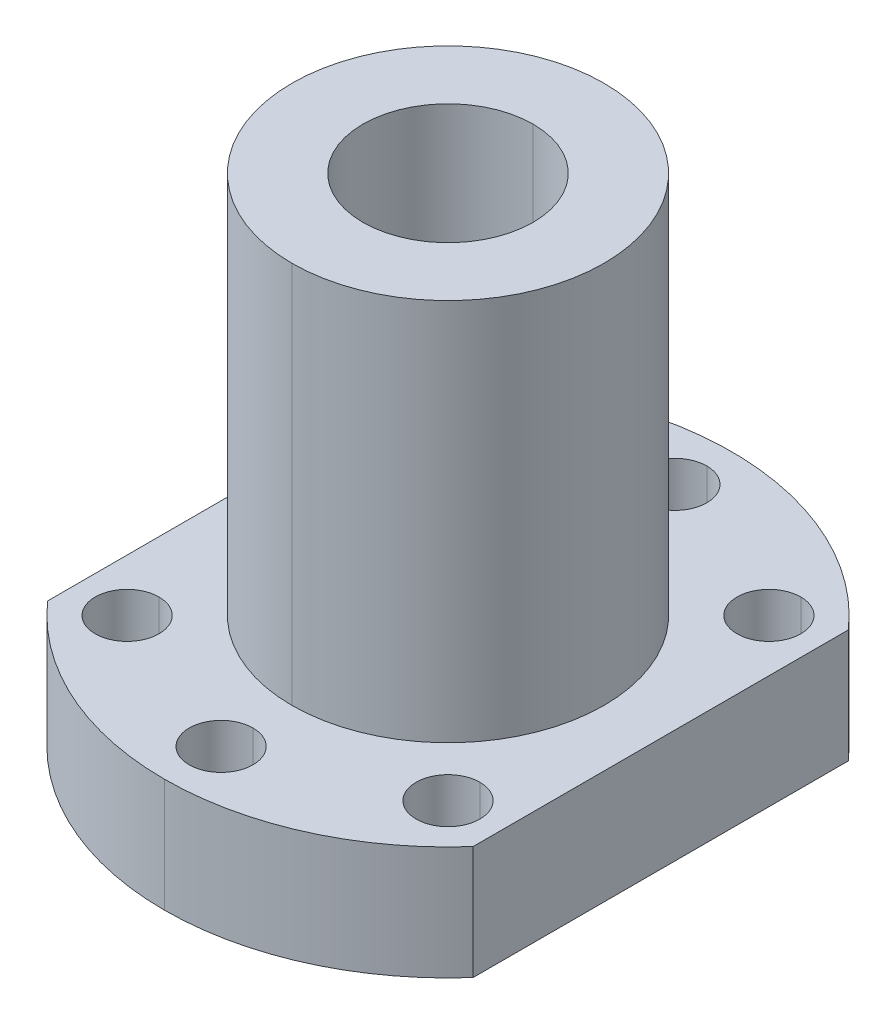
ISO-10303-21;
HEADER;
FILE_DESCRIPTION(('STEP AP214'),'2;1');
FILE_NAME('part.step','',(''),(''),'','','');
FILE_SCHEMA(('AUTOMOTIVE_DESIGN { 1 0 10303 214 1 1 1 1 }'));
ENDSEC;
DATA;
#1=APPLICATION_CONTEXT('core data for automotive mechanical design processes');
#2=APPLICATION_PROTOCOL_DEFINITION('international standard','automotive_design',2000,#1);
#3=PRODUCT_CONTEXT('',#1,'mechanical');
#4=PRODUCT('Part','Part','',(#3));
#5=PRODUCT_RELATED_PRODUCT_CATEGORY('part','',(#4));
#6=PRODUCT_DEFINITION_FORMATION('','',#4);
#7=PRODUCT_DEFINITION_CONTEXT('part definition',#1,'design');
#8=PRODUCT_DEFINITION('design','',#6,#7);
#9=PRODUCT_DEFINITION_SHAPE('','',#8);
#10=(LENGTH_UNIT() NAMED_UNIT(*) SI_UNIT(.MILLI.,.METRE.));
#11=(NAMED_UNIT(*) PLANE_ANGLE_UNIT() SI_UNIT($,.RADIAN.));
#12=(NAMED_UNIT(*) SI_UNIT($,.STERADIAN.) SOLID_ANGLE_UNIT());
#13=UNCERTAINTY_MEASURE_WITH_UNIT(LENGTH_MEASURE(1.E-05),#10,'distance_accuracy_value','');
#14=(GEOMETRIC_REPRESENTATION_CONTEXT(3) GLOBAL_UNCERTAINTY_ASSIGNED_CONTEXT((#13)) GLOBAL_UNIT_ASSIGNED_CONTEXT((#10,
#11,#12)) REPRESENTATION_CONTEXT('',''));
#15=CARTESIAN_POINT('',(0.,0.,0.));
#16=DIRECTION('',(0.,0.,1.));
#17=DIRECTION('',(1.,0.,0.));
#18=AXIS2_PLACEMENT_3D('',#15,#16,#17);
#19=CARTESIAN_POINT('',(-11.3137084989848,42.,11.3137084989848));
#20=DIRECTION('',(0.,1.,0.));
#21=DIRECTION('',(0.,0.,1.));
#22=AXIS2_PLACEMENT_3D('',#19,#20,#21);
#23=CYLINDRICAL_SURFACE('',#22,2.25);
#24=CARTESIAN_POINT('',(-11.3137084989848,42.,11.3137084989848));
#25=DIRECTION('',(0.,-1.,0.));
#26=DIRECTION('',(0.,0.,-1.));
#27=AXIS2_PLACEMENT_3D('',#24,#25,#26);
#28=CIRCLE('',#27,2.25);
#29=CARTESIAN_POINT('',(-11.3137084989848,42.,13.5637084989848));
#30=VERTEX_POINT('',#29);
#31=CARTESIAN_POINT('',(-11.3137084989848,42.,9.06370849898478));
#32=VERTEX_POINT('',#31);
#33=EDGE_CURVE('P0_E11',#30,#32,#28,.T.);
#34=ORIENTED_EDGE('',*,*,#33,.T.);
#35=DIRECTION('',(0.,1.,0.));
#36=VECTOR('',#35,1.);
#37=CARTESIAN_POINT('',(-11.3137084989848,42.,9.06370849898478));
#38=LINE('',#37,#36);
#39=CARTESIAN_POINT('',(-11.3137084989848,50.,9.06370849898478));
#40=VERTEX_POINT('',#39);
#41=EDGE_CURVE('P0_E27',#32,#40,#38,.T.);
#42=ORIENTED_EDGE('',*,*,#41,.T.);
#43=CARTESIAN_POINT('',(-11.3137084989848,50.,11.3137084989848));
#44=DIRECTION('',(0.,-1.,0.));
#45=DIRECTION('',(0.,0.,-1.));
#46=AXIS2_PLACEMENT_3D('',#43,#44,#45);
#47=CIRCLE('',#46,2.25);
#48=CARTESIAN_POINT('',(-11.3137084989848,50.,13.5637084989848));
#49=VERTEX_POINT('',#48);
#50=EDGE_CURVE('P0_E289',#49,#40,#47,.T.);
#51=ORIENTED_EDGE('',*,*,#50,.F.);
#52=DIRECTION('',(0.,1.,0.));
#53=VECTOR('',#52,1.);
#54=CARTESIAN_POINT('',(-11.3137084989848,42.,13.5637084989848));
#55=LINE('',#54,#53);
#56=EDGE_CURVE('P0_E246',#30,#49,#55,.T.);
#57=ORIENTED_EDGE('',*,*,#56,.F.);
#58=EDGE_LOOP('',(#34,#42,#51,#57));
#59=FACE_BOUND('',#58,.T.);
#60=ADVANCED_FACE('P0_F16',(#59),#23,.F.);
#61=CARTESIAN_POINT('',(-11.3137084989848,42.,-11.3137084989848));
#62=DIRECTION('',(0.,1.,0.));
#63=DIRECTION('',(0.,0.,1.));
#64=AXIS2_PLACEMENT_3D('',#61,#62,#63);
#65=CYLINDRICAL_SURFACE('',#64,2.25);
#66=CARTESIAN_POINT('',(-11.3137084989848,42.,-11.3137084989848));
#67=DIRECTION('',(0.,-1.,0.));
#68=DIRECTION('',(0.,0.,-1.));
#69=AXIS2_PLACEMENT_3D('',#66,#67,#68);
#70=CIRCLE('',#69,2.25);
#71=CARTESIAN_POINT('',(-11.3137084989848,42.,-9.06370849898477));
#72=VERTEX_POINT('',#71);
#73=CARTESIAN_POINT('',(-11.3137084989848,42.,-13.5637084989848));
#74=VERTEX_POINT('',#73);
#75=EDGE_CURVE('P0_E357',#72,#74,#70,.T.);
#76=ORIENTED_EDGE('',*,*,#75,.T.);
#77=DIRECTION('',(0.,1.,0.));
#78=VECTOR('',#77,1.);
#79=CARTESIAN_POINT('',(-11.3137084989848,42.,-13.5637084989848));
#80=LINE('',#79,#78);
#81=CARTESIAN_POINT('',(-11.3137084989848,50.,-13.5637084989848));
#82=VERTEX_POINT('',#81);
#83=EDGE_CURVE('P0_E344',#74,#82,#80,.T.);
#84=ORIENTED_EDGE('',*,*,#83,.T.);
#85=CARTESIAN_POINT('',(-11.3137084989848,50.,-11.3137084989848));
#86=DIRECTION('',(0.,-1.,0.));
#87=DIRECTION('',(0.,0.,-1.));
#88=AXIS2_PLACEMENT_3D('',#85,#86,#87);
#89=CIRCLE('',#88,2.25);
#90=CARTESIAN_POINT('',(-11.3137084989848,50.,-9.06370849898477));
#91=VERTEX_POINT('',#90);
#92=EDGE_CURVE('P0_E296',#91,#82,#89,.T.);
#93=ORIENTED_EDGE('',*,*,#92,.F.);
#94=DIRECTION('',(0.,1.,0.));
#95=VECTOR('',#94,1.);
#96=CARTESIAN_POINT('',(-11.3137084989848,42.,-9.06370849898477));
#97=LINE('',#96,#95);
#98=EDGE_CURVE('P0_E245',#72,#91,#97,.T.);
#99=ORIENTED_EDGE('',*,*,#98,.F.);
#100=EDGE_LOOP('',(#76,#84,#93,#99));
#101=FACE_BOUND('',#100,.T.);
#102=ADVANCED_FACE('P0_F663',(#101),#65,.F.);
#103=CARTESIAN_POINT('',(0.,42.,-16.));
#104=DIRECTION('',(0.,1.,0.));
#105=DIRECTION('',(0.,0.,1.));
#106=AXIS2_PLACEMENT_3D('',#103,#104,#105);
#107=CYLINDRICAL_SURFACE('',#106,2.25);
#108=CARTESIAN_POINT('',(0.,42.,-16.));
#109=DIRECTION('',(0.,-1.,0.));
#110=DIRECTION('',(0.,0.,-1.));
#111=AXIS2_PLACEMENT_3D('',#108,#109,#110);
#112=CIRCLE('',#111,2.25);
#113=CARTESIAN_POINT('',(0.,42.,-13.75));
#114=VERTEX_POINT('',#113);
#115=CARTESIAN_POINT('',(0.,42.,-18.25));
#116=VERTEX_POINT('',#115);
#117=EDGE_CURVE('P0_E340',#114,#116,#112,.T.);
#118=ORIENTED_EDGE('',*,*,#117,.T.);
#119=DIRECTION('',(0.,1.,0.));
#120=VECTOR('',#119,1.);
#121=CARTESIAN_POINT('',(0.,42.,-18.25));
#122=LINE('',#121,#120);
#123=CARTESIAN_POINT('',(0.,50.,-18.25));
#124=VERTEX_POINT('',#123);
#125=EDGE_CURVE('P0_E345',#116,#124,#122,.T.);
#126=ORIENTED_EDGE('',*,*,#125,.T.);
#127=CARTESIAN_POINT('',(0.,50.,-16.));
#128=DIRECTION('',(0.,-1.,0.));
#129=DIRECTION('',(0.,0.,-1.));
#130=AXIS2_PLACEMENT_3D('',#127,#128,#129);
#131=CIRCLE('',#130,2.25);
#132=CARTESIAN_POINT('',(0.,50.,-13.75));
#133=VERTEX_POINT('',#132);
#134=EDGE_CURVE('P0_E328',#133,#124,#131,.T.);
#135=ORIENTED_EDGE('',*,*,#134,.F.);
#136=DIRECTION('',(0.,1.,0.));
#137=VECTOR('',#136,1.);
#138=CARTESIAN_POINT('',(0.,42.,-13.75));
#139=LINE('',#138,#137);
#140=EDGE_CURVE('P0_E237',#114,#133,#139,.T.);
#141=ORIENTED_EDGE('',*,*,#140,.F.);
#142=EDGE_LOOP('',(#118,#126,#135,#141));
#143=FACE_BOUND('',#142,.T.);
#144=ADVANCED_FACE('P0_F625',(#143),#107,.F.);
#145=CARTESIAN_POINT('',(11.3137084989848,42.,-11.3137084989848));
#146=DIRECTION('',(0.,1.,0.));
#147=DIRECTION('',(0.,0.,1.));
#148=AXIS2_PLACEMENT_3D('',#145,#146,#147);
#149=CYLINDRICAL_SURFACE('',#148,2.25);
#150=CARTESIAN_POINT('',(11.3137084989848,42.,-11.3137084989848));
#151=DIRECTION('',(0.,-1.,0.));
#152=DIRECTION('',(0.,0.,-1.));
#153=AXIS2_PLACEMENT_3D('',#150,#151,#152);
#154=CIRCLE('',#153,2.25);
#155=CARTESIAN_POINT('',(11.3137084989848,42.,-9.06370849898477));
#156=VERTEX_POINT('',#155);
#157=CARTESIAN_POINT('',(11.3137084989848,42.,-13.5637084989848));
#158=VERTEX_POINT('',#157);
#159=EDGE_CURVE('P0_E369',#156,#158,#154,.T.);
#160=ORIENTED_EDGE('',*,*,#159,.T.);
#161=DIRECTION('',(0.,1.,0.));
#162=VECTOR('',#161,1.);
#163=CARTESIAN_POINT('',(11.3137084989848,42.,-13.5637084989848));
#164=LINE('',#163,#162);
#165=CARTESIAN_POINT('',(11.3137084989848,50.,-13.5637084989848));
#166=VERTEX_POINT('',#165);
#167=EDGE_CURVE('P0_E336',#158,#166,#164,.T.);
#168=ORIENTED_EDGE('',*,*,#167,.T.);
#169=CARTESIAN_POINT('',(11.3137084989848,50.,-11.3137084989848));
#170=DIRECTION('',(0.,-1.,0.));
#171=DIRECTION('',(0.,0.,-1.));
#172=AXIS2_PLACEMENT_3D('',#169,#170,#171);
#173=CIRCLE('',#172,2.25);
#174=CARTESIAN_POINT('',(11.3137084989848,50.,-9.06370849898477));
#175=VERTEX_POINT('',#174);
#176=EDGE_CURVE('P0_E311',#175,#166,#173,.T.);
#177=ORIENTED_EDGE('',*,*,#176,.F.);
#178=DIRECTION('',(0.,1.,0.));
#179=VECTOR('',#178,1.);
#180=CARTESIAN_POINT('',(11.3137084989848,42.,-9.06370849898477));
#181=LINE('',#180,#179);
#182=EDGE_CURVE('P0_E307',#156,#175,#181,.T.);
#183=ORIENTED_EDGE('',*,*,#182,.F.);
#184=EDGE_LOOP('',(#160,#168,#177,#183));
#185=FACE_BOUND('',#184,.T.);
#186=ADVANCED_FACE('P0_F620',(#185),#149,.F.);
#187=CARTESIAN_POINT('',(11.3137084989848,42.,11.3137084989848));
#188=DIRECTION('',(0.,1.,0.));
#189=DIRECTION('',(0.,0.,1.));
#190=AXIS2_PLACEMENT_3D('',#187,#188,#189);
#191=CYLINDRICAL_SURFACE('',#190,2.25);
#192=CARTESIAN_POINT('',(11.3137084989848,42.,11.3137084989848));
#193=DIRECTION('',(0.,-1.,0.));
#194=DIRECTION('',(0.,0.,-1.));
#195=AXIS2_PLACEMENT_3D('',#192,#193,#194);
#196=CIRCLE('',#195,2.25);
#197=CARTESIAN_POINT('',(11.3137084989848,42.,13.5637084989848));
#198=VERTEX_POINT('',#197);
#199=CARTESIAN_POINT('',(11.3137084989848,42.,9.06370849898477));
#200=VERTEX_POINT('',#199);
#201=EDGE_CURVE('P0_E332',#198,#200,#196,.T.);
#202=ORIENTED_EDGE('',*,*,#201,.T.);
#203=DIRECTION('',(0.,1.,0.));
#204=VECTOR('',#203,1.);
#205=CARTESIAN_POINT('',(11.3137084989848,42.,9.06370849898477));
#206=LINE('',#205,#204);
#207=CARTESIAN_POINT('',(11.3137084989848,50.,9.06370849898477));
#208=VERTEX_POINT('',#207);
#209=EDGE_CURVE('P0_E277',#200,#208,#206,.T.);
#210=ORIENTED_EDGE('',*,*,#209,.T.);
#211=CARTESIAN_POINT('',(11.3137084989848,50.,11.3137084989848));
#212=DIRECTION('',(0.,-1.,0.));
#213=DIRECTION('',(0.,0.,-1.));
#214=AXIS2_PLACEMENT_3D('',#211,#212,#213);
#215=CIRCLE('',#214,2.25);
#216=CARTESIAN_POINT('',(11.3137084989848,50.,13.5637084989848));
#217=VERTEX_POINT('',#216);
#218=EDGE_CURVE('P0_E283',#217,#208,#215,.T.);
#219=ORIENTED_EDGE('',*,*,#218,.F.);
#220=DIRECTION('',(0.,1.,0.));
#221=VECTOR('',#220,1.);
#222=CARTESIAN_POINT('',(11.3137084989848,42.,13.5637084989848));
#223=LINE('',#222,#221);
#224=EDGE_CURVE('P0_E264',#198,#217,#223,.T.);
#225=ORIENTED_EDGE('',*,*,#224,.F.);
#226=EDGE_LOOP('',(#202,#210,#219,#225));
#227=FACE_BOUND('',#226,.T.);
#228=ADVANCED_FACE('P0_F624',(#227),#191,.F.);
#229=CARTESIAN_POINT('',(0.,42.,16.));
#230=DIRECTION('',(0.,1.,0.));
#231=DIRECTION('',(0.,0.,1.));
#232=AXIS2_PLACEMENT_3D('',#229,#230,#231);
#233=CYLINDRICAL_SURFACE('',#232,2.25);
#234=CARTESIAN_POINT('',(0.,42.,16.));
#235=DIRECTION('',(0.,-1.,0.));
#236=DIRECTION('',(0.,0.,-1.));
#237=AXIS2_PLACEMENT_3D('',#234,#235,#236);
#238=CIRCLE('',#237,2.25);
#239=CARTESIAN_POINT('',(0.,42.,18.25));
#240=VERTEX_POINT('',#239);
#241=CARTESIAN_POINT('',(0.,42.,13.75));
#242=VERTEX_POINT('',#241);
#243=EDGE_CURVE('P0_E20',#240,#242,#238,.T.);
#244=ORIENTED_EDGE('',*,*,#243,.T.);
#245=DIRECTION('',(0.,1.,0.));
#246=VECTOR('',#245,1.);
#247=CARTESIAN_POINT('',(0.,42.,13.75));
#248=LINE('',#247,#246);
#249=CARTESIAN_POINT('',(0.,50.,13.75));
#250=VERTEX_POINT('',#249);
#251=EDGE_CURVE('P0_E398',#242,#250,#248,.T.);
#252=ORIENTED_EDGE('',*,*,#251,.T.);
#253=CARTESIAN_POINT('',(0.,50.,16.));
#254=DIRECTION('',(0.,-1.,0.));
#255=DIRECTION('',(0.,0.,-1.));
#256=AXIS2_PLACEMENT_3D('',#253,#254,#255);
#257=CIRCLE('',#256,2.25);
#258=CARTESIAN_POINT('',(0.,50.,18.25));
#259=VERTEX_POINT('',#258);
#260=EDGE_CURVE('P0_E324',#259,#250,#257,.T.);
#261=ORIENTED_EDGE('',*,*,#260,.F.);
#262=DIRECTION('',(0.,1.,0.));
#263=VECTOR('',#262,1.);
#264=CARTESIAN_POINT('',(0.,42.,18.25));
#265=LINE('',#264,#263);
#266=EDGE_CURVE('P0_E251',#240,#259,#265,.T.);
#267=ORIENTED_EDGE('',*,*,#266,.F.);
#268=EDGE_LOOP('',(#244,#252,#261,#267));
#269=FACE_BOUND('',#268,.T.);
#270=ADVANCED_FACE('P0_F634',(#269),#233,.F.);
#271=CARTESIAN_POINT('',(0.,42.,0.));
#272=DIRECTION('',(0.,1.,0.));
#273=DIRECTION('',(0.,0.,1.));
#274=AXIS2_PLACEMENT_3D('',#271,#272,#273);
#275=CYLINDRICAL_SURFACE('',#274,6.);
#276=CARTESIAN_POINT('',(0.,42.,0.));
#277=DIRECTION('',(0.,-1.,0.));
#278=DIRECTION('',(0.,0.,-1.));
#279=AXIS2_PLACEMENT_3D('',#276,#277,#278);
#280=CIRCLE('',#279,6.);
#281=CARTESIAN_POINT('',(0.,42.,6.));
#282=VERTEX_POINT('',#281);
#283=CARTESIAN_POINT('',(0.,42.,-6.));
#284=VERTEX_POINT('',#283);
#285=EDGE_CURVE('P0_E319',#282,#284,#280,.T.);
#286=ORIENTED_EDGE('',*,*,#285,.T.);
#287=DIRECTION('',(0.,1.,0.));
#288=VECTOR('',#287,1.);
#289=CARTESIAN_POINT('',(0.,42.,-6.));
#290=LINE('',#289,#288);
#291=CARTESIAN_POINT('',(0.,50.,-6.));
#292=VERTEX_POINT('',#291);
#293=EDGE_CURVE('P0_E315',#284,#292,#290,.T.);
#294=ORIENTED_EDGE('',*,*,#293,.T.);
#295=CARTESIAN_POINT('',(0.,50.,0.));
#296=DIRECTION('',(0.,-1.,0.));
#297=DIRECTION('',(0.,0.,-1.));
#298=AXIS2_PLACEMENT_3D('',#295,#296,#297);
#299=CIRCLE('',#298,6.);
#300=CARTESIAN_POINT('',(0.,50.,6.));
#301=VERTEX_POINT('',#300);
#302=EDGE_CURVE('P0_E224',#301,#292,#299,.T.);
#303=ORIENTED_EDGE('',*,*,#302,.F.);
#304=DIRECTION('',(0.,1.,0.));
#305=VECTOR('',#304,1.);
#306=CARTESIAN_POINT('',(0.,42.,6.));
#307=LINE('',#306,#305);
#308=EDGE_CURVE('P0_E261',#282,#301,#307,.T.);
#309=ORIENTED_EDGE('',*,*,#308,.F.);
#310=EDGE_LOOP('',(#286,#294,#303,#309));
#311=FACE_BOUND('',#310,.T.);
#312=ADVANCED_FACE('P0_F427',(#311),#275,.F.);
#313=CARTESIAN_POINT('',(0.,42.,0.));
#314=DIRECTION('',(0.,1.,0.));
#315=DIRECTION('',(0.,0.,1.));
#316=AXIS2_PLACEMENT_3D('',#313,#314,#315);
#317=CYLINDRICAL_SURFACE('',#316,20.);
#318=CARTESIAN_POINT('',(0.,42.,0.));
#319=DIRECTION('',(0.,-1.,0.));
#320=DIRECTION('',(0.,0.,-1.));
#321=AXIS2_PLACEMENT_3D('',#318,#319,#320);
#322=CIRCLE('',#321,20.);
#323=CARTESIAN_POINT('',(0.,42.,20.));
#324=VERTEX_POINT('',#323);
#325=CARTESIAN_POINT('',(-15.,42.,13.2287565553229));
#326=VERTEX_POINT('',#325);
#327=EDGE_CURVE('P0_E203',#324,#326,#322,.T.);
#328=ORIENTED_EDGE('',*,*,#327,.F.);
#329=DIRECTION('',(0.,1.,0.));
#330=VECTOR('',#329,1.);
#331=CARTESIAN_POINT('',(0.,42.,20.));
#332=LINE('',#331,#330);
#333=CARTESIAN_POINT('',(0.,50.,20.));
#334=VERTEX_POINT('',#333);
#335=EDGE_CURVE('P0_E320',#324,#334,#332,.T.);
#336=ORIENTED_EDGE('',*,*,#335,.T.);
#337=CARTESIAN_POINT('',(0.,50.,0.));
#338=DIRECTION('',(0.,-1.,0.));
#339=DIRECTION('',(0.,0.,-1.));
#340=AXIS2_PLACEMENT_3D('',#337,#338,#339);
#341=CIRCLE('',#340,20.);
#342=CARTESIAN_POINT('',(-15.,50.,13.2287565553229));
#343=VERTEX_POINT('',#342);
#344=EDGE_CURVE('P0_E205',#334,#343,#341,.T.);
#345=ORIENTED_EDGE('',*,*,#344,.T.);
#346=DIRECTION('',(0.,1.,0.));
#347=VECTOR('',#346,1.);
#348=CARTESIAN_POINT('',(-15.,42.,13.2287565553229));
#349=LINE('',#348,#347);
#350=EDGE_CURVE('P0_E195',#326,#343,#349,.T.);
#351=ORIENTED_EDGE('',*,*,#350,.F.);
#352=EDGE_LOOP('',(#328,#336,#345,#351));
#353=FACE_BOUND('',#352,.T.);
#354=ADVANCED_FACE('P0_F201',(#353),#317,.T.);
#355=CARTESIAN_POINT('',(0.,42.,0.));
#356=DIRECTION('',(0.,-1.,0.));
#357=DIRECTION('',(0.,0.,-1.));
#358=AXIS2_PLACEMENT_3D('',#355,#356,#357);
#359=PLANE('',#358);
#360=CARTESIAN_POINT('',(0.,42.,0.));
#361=DIRECTION('',(0.,-1.,0.));
#362=DIRECTION('',(0.,0.,-1.));
#363=AXIS2_PLACEMENT_3D('',#360,#361,#362);
#364=CIRCLE('',#363,20.);
#365=CARTESIAN_POINT('',(-15.,42.,-13.2287565553229));
#366=VERTEX_POINT('',#365);
#367=CARTESIAN_POINT('',(15.,42.,-13.2287565553229));
#368=VERTEX_POINT('',#367);
#369=EDGE_CURVE('P0_E382',#366,#368,#364,.T.);
#370=ORIENTED_EDGE('',*,*,#369,.T.);
#371=DIRECTION('',(0.,0.,1.));
#372=VECTOR('',#371,1.);
#373=CARTESIAN_POINT('',(15.,42.,13.2287565553229));
#374=LINE('',#373,#372);
#375=CARTESIAN_POINT('',(15.,42.,13.2287565553229));
#376=VERTEX_POINT('',#375);
#377=EDGE_CURVE('P0_E352',#368,#376,#374,.T.);
#378=ORIENTED_EDGE('',*,*,#377,.T.);
#379=CARTESIAN_POINT('',(0.,42.,0.));
#380=DIRECTION('',(0.,-1.,0.));
#381=DIRECTION('',(0.,0.,-1.));
#382=AXIS2_PLACEMENT_3D('',#379,#380,#381);
#383=CIRCLE('',#382,20.);
#384=EDGE_CURVE('P0_E217',#376,#324,#383,.T.);
#385=ORIENTED_EDGE('',*,*,#384,.T.);
#386=ORIENTED_EDGE('',*,*,#327,.T.);
#387=DIRECTION('',(0.,0.,-1.));
#388=VECTOR('',#387,1.);
#389=CARTESIAN_POINT('',(-15.,42.,13.2287565553229));
#390=LINE('',#389,#388);
#391=EDGE_CURVE('P0_E214',#326,#366,#390,.T.);
#392=ORIENTED_EDGE('',*,*,#391,.T.);
#393=EDGE_LOOP('',(#370,#378,#385,#386,#392));
#394=FACE_BOUND('',#393,.T.);
#395=ORIENTED_EDGE('',*,*,#75,.F.);
#396=CARTESIAN_POINT('',(-11.3137084989848,42.,-11.3137084989848));
#397=DIRECTION('',(0.,-1.,0.));
#398=DIRECTION('',(0.,0.,-1.));
#399=AXIS2_PLACEMENT_3D('',#396,#397,#398);
#400=CIRCLE('',#399,2.25);
#401=EDGE_CURVE('P0_E241',#74,#72,#400,.T.);
#402=ORIENTED_EDGE('',*,*,#401,.F.);
#403=EDGE_LOOP('',(#395,#402));
#404=FACE_BOUND('',#403,.T.);
#405=ORIENTED_EDGE('',*,*,#159,.F.);
#406=CARTESIAN_POINT('',(11.3137084989848,42.,-11.3137084989848));
#407=DIRECTION('',(0.,-1.,0.));
#408=DIRECTION('',(0.,0.,-1.));
#409=AXIS2_PLACEMENT_3D('',#406,#407,#408);
#410=CIRCLE('',#409,2.25);
#411=EDGE_CURVE('P0_E273',#158,#156,#410,.T.);
#412=ORIENTED_EDGE('',*,*,#411,.F.);
#413=EDGE_LOOP('',(#405,#412));
#414=FACE_BOUND('',#413,.T.);
#415=ORIENTED_EDGE('',*,*,#243,.F.);
#416=CARTESIAN_POINT('',(0.,42.,16.));
#417=DIRECTION('',(0.,-1.,0.));
#418=DIRECTION('',(0.,0.,-1.));
#419=AXIS2_PLACEMENT_3D('',#416,#417,#418);
#420=CIRCLE('',#419,2.25);
#421=EDGE_CURVE('P0_E235',#242,#240,#420,.T.);
#422=ORIENTED_EDGE('',*,*,#421,.F.);
#423=EDGE_LOOP('',(#415,#422));
#424=FACE_BOUND('',#423,.T.);
#425=ORIENTED_EDGE('',*,*,#285,.F.);
#426=CARTESIAN_POINT('',(0.,42.,0.));
#427=DIRECTION('',(0.,-1.,0.));
#428=DIRECTION('',(0.,0.,-1.));
#429=AXIS2_PLACEMENT_3D('',#426,#427,#428);
#430=CIRCLE('',#429,6.);
#431=EDGE_CURVE('P0_E207',#284,#282,#430,.T.);
#432=ORIENTED_EDGE('',*,*,#431,.F.);
#433=EDGE_LOOP('',(#425,#432));
#434=FACE_BOUND('',#433,.T.);
#435=ORIENTED_EDGE('',*,*,#201,.F.);
#436=CARTESIAN_POINT('',(11.3137084989848,42.,11.3137084989848));
#437=DIRECTION('',(0.,-1.,0.));
#438=DIRECTION('',(0.,0.,-1.));
#439=AXIS2_PLACEMENT_3D('',#436,#437,#438);
#440=CIRCLE('',#439,2.25);
#441=EDGE_CURVE('P0_E253',#200,#198,#440,.T.);
#442=ORIENTED_EDGE('',*,*,#441,.F.);
#443=EDGE_LOOP('',(#435,#442));
#444=FACE_BOUND('',#443,.T.);
#445=ORIENTED_EDGE('',*,*,#117,.F.);
#446=CARTESIAN_POINT('',(0.,42.,-16.));
#447=DIRECTION('',(0.,-1.,0.));
#448=DIRECTION('',(0.,0.,-1.));
#449=AXIS2_PLACEMENT_3D('',#446,#447,#448);
#450=CIRCLE('',#449,2.25);
#451=EDGE_CURVE('P0_E240',#116,#114,#450,.T.);
#452=ORIENTED_EDGE('',*,*,#451,.F.);
#453=EDGE_LOOP('',(#445,#452));
#454=FACE_BOUND('',#453,.T.);
#455=ORIENTED_EDGE('',*,*,#33,.F.);
#456=CARTESIAN_POINT('',(-11.3137084989848,42.,11.3137084989848));
#457=DIRECTION('',(0.,-1.,0.));
#458=DIRECTION('',(0.,0.,-1.));
#459=AXIS2_PLACEMENT_3D('',#456,#457,#458);
#460=CIRCLE('',#459,2.25);
#461=EDGE_CURVE('P0_E242',#32,#30,#460,.T.);
#462=ORIENTED_EDGE('',*,*,#461,.F.);
#463=EDGE_LOOP('',(#455,#462));
#464=FACE_BOUND('',#463,.T.);
#465=ADVANCED_FACE('P0_F212',(#394,#404,#414,#424,#434,#444,#454,#464),#359,.T.);
#466=CARTESIAN_POINT('',(0.,50.,0.));
#467=DIRECTION('',(0.,-1.,0.));
#468=DIRECTION('',(0.,0.,-1.));
#469=AXIS2_PLACEMENT_3D('',#466,#467,#468);
#470=PLANE('',#469);
#471=CARTESIAN_POINT('',(0.,50.,0.));
#472=DIRECTION('',(0.,-1.,0.));
#473=DIRECTION('',(0.,0.,-1.));
#474=AXIS2_PLACEMENT_3D('',#471,#472,#473);
#475=CIRCLE('',#474,20.);
#476=CARTESIAN_POINT('',(-15.,50.,-13.2287565553229));
#477=VERTEX_POINT('',#476);
#478=CARTESIAN_POINT('',(15.,50.,-13.2287565553229));
#479=VERTEX_POINT('',#478);
#480=EDGE_CURVE('P0_E247',#477,#479,#475,.T.);
#481=ORIENTED_EDGE('',*,*,#480,.F.);
#482=DIRECTION('',(0.,0.,-1.));
#483=VECTOR('',#482,1.);
#484=CARTESIAN_POINT('',(-15.,50.,13.2287565553229));
#485=LINE('',#484,#483);
#486=EDGE_CURVE('P0_E165',#343,#477,#485,.T.);
#487=ORIENTED_EDGE('',*,*,#486,.F.);
#488=ORIENTED_EDGE('',*,*,#344,.F.);
#489=CARTESIAN_POINT('',(0.,50.,0.));
#490=DIRECTION('',(0.,-1.,0.));
#491=DIRECTION('',(0.,0.,-1.));
#492=AXIS2_PLACEMENT_3D('',#489,#490,#491);
#493=CIRCLE('',#492,20.);
#494=CARTESIAN_POINT('',(15.,50.,13.2287565553229));
#495=VERTEX_POINT('',#494);
#496=EDGE_CURVE('P0_E179',#495,#334,#493,.T.);
#497=ORIENTED_EDGE('',*,*,#496,.F.);
#498=DIRECTION('',(0.,0.,1.));
#499=VECTOR('',#498,1.);
#500=CARTESIAN_POINT('',(15.,50.,13.2287565553229));
#501=LINE('',#500,#499);
#502=EDGE_CURVE('P0_E279',#479,#495,#501,.T.);
#503=ORIENTED_EDGE('',*,*,#502,.F.);
#504=EDGE_LOOP('',(#481,#487,#488,#497,#503));
#505=FACE_BOUND('',#504,.T.);
#506=ORIENTED_EDGE('',*,*,#302,.T.);
#507=CARTESIAN_POINT('',(0.,50.,0.));
#508=DIRECTION('',(0.,-1.,0.));
#509=DIRECTION('',(0.,0.,-1.));
#510=AXIS2_PLACEMENT_3D('',#507,#508,#509);
#511=CIRCLE('',#510,6.);
#512=EDGE_CURVE('P0_E231',#292,#301,#511,.T.);
#513=ORIENTED_EDGE('',*,*,#512,.T.);
#514=EDGE_LOOP('',(#506,#513));
#515=FACE_BOUND('',#514,.T.);
#516=ORIENTED_EDGE('',*,*,#260,.T.);
#517=CARTESIAN_POINT('',(0.,50.,16.));
#518=DIRECTION('',(0.,-1.,0.));
#519=DIRECTION('',(0.,0.,-1.));
#520=AXIS2_PLACEMENT_3D('',#517,#518,#519);
#521=CIRCLE('',#520,2.25);
#522=EDGE_CURVE('P0_E287',#250,#259,#521,.T.);
#523=ORIENTED_EDGE('',*,*,#522,.T.);
#524=EDGE_LOOP('',(#516,#523));
#525=FACE_BOUND('',#524,.T.);
#526=ORIENTED_EDGE('',*,*,#218,.T.);
#527=CARTESIAN_POINT('',(11.3137084989848,50.,11.3137084989848));
#528=DIRECTION('',(0.,-1.,0.));
#529=DIRECTION('',(0.,0.,-1.));
#530=AXIS2_PLACEMENT_3D('',#527,#528,#529);
#531=CIRCLE('',#530,2.25);
#532=EDGE_CURVE('P0_E288',#208,#217,#531,.T.);
#533=ORIENTED_EDGE('',*,*,#532,.T.);
#534=EDGE_LOOP('',(#526,#533));
#535=FACE_BOUND('',#534,.T.);
#536=ORIENTED_EDGE('',*,*,#176,.T.);
#537=CARTESIAN_POINT('',(11.3137084989848,50.,-11.3137084989848));
#538=DIRECTION('',(0.,-1.,0.));
#539=DIRECTION('',(0.,0.,-1.));
#540=AXIS2_PLACEMENT_3D('',#537,#538,#539);
#541=CIRCLE('',#540,2.25);
#542=EDGE_CURVE('P0_E314',#166,#175,#541,.T.);
#543=ORIENTED_EDGE('',*,*,#542,.T.);
#544=EDGE_LOOP('',(#536,#543));
#545=FACE_BOUND('',#544,.T.);
#546=ORIENTED_EDGE('',*,*,#134,.T.);
#547=CARTESIAN_POINT('',(0.,50.,-16.));
#548=DIRECTION('',(0.,-1.,0.));
#549=DIRECTION('',(0.,0.,-1.));
#550=AXIS2_PLACEMENT_3D('',#547,#548,#549);
#551=CIRCLE('',#550,2.25);
#552=EDGE_CURVE('P0_E374',#124,#133,#551,.T.);
#553=ORIENTED_EDGE('',*,*,#552,.T.);
#554=EDGE_LOOP('',(#546,#553));
#555=FACE_BOUND('',#554,.T.);
#556=ORIENTED_EDGE('',*,*,#92,.T.);
#557=CARTESIAN_POINT('',(-11.3137084989848,50.,-11.3137084989848));
#558=DIRECTION('',(0.,-1.,0.));
#559=DIRECTION('',(0.,0.,-1.));
#560=AXIS2_PLACEMENT_3D('',#557,#558,#559);
#561=CIRCLE('',#560,2.25);
#562=EDGE_CURVE('P0_E292',#82,#91,#561,.T.);
#563=ORIENTED_EDGE('',*,*,#562,.T.);
#564=EDGE_LOOP('',(#556,#563));
#565=FACE_BOUND('',#564,.T.);
#566=ORIENTED_EDGE('',*,*,#50,.T.);
#567=CARTESIAN_POINT('',(-11.3137084989848,50.,11.3137084989848));
#568=DIRECTION('',(0.,-1.,0.));
#569=DIRECTION('',(0.,0.,-1.));
#570=AXIS2_PLACEMENT_3D('',#567,#568,#569);
#571=CIRCLE('',#570,2.25);
#572=EDGE_CURVE('P0_E250',#40,#49,#571,.T.);
#573=ORIENTED_EDGE('',*,*,#572,.T.);
#574=EDGE_LOOP('',(#566,#573));
#575=FACE_BOUND('',#574,.T.);
#576=ADVANCED_FACE('P0_F435',(#505,#515,#525,#535,#545,#555,#565,#575),#470,.F.);
#577=CARTESIAN_POINT('',(0.,42.,0.));
#578=DIRECTION('',(0.,1.,0.));
#579=DIRECTION('',(0.,0.,1.));
#580=AXIS2_PLACEMENT_3D('',#577,#578,#579);
#581=CYLINDRICAL_SURFACE('',#580,20.);
#582=ORIENTED_EDGE('',*,*,#480,.T.);
#583=DIRECTION('',(0.,1.,0.));
#584=VECTOR('',#583,1.);
#585=CARTESIAN_POINT('',(15.,42.,-13.2287565553229));
#586=LINE('',#585,#584);
#587=EDGE_CURVE('P0_E282',#368,#479,#586,.T.);
#588=ORIENTED_EDGE('',*,*,#587,.F.);
#589=ORIENTED_EDGE('',*,*,#369,.F.);
#590=DIRECTION('',(0.,1.,0.));
#591=VECTOR('',#590,1.);
#592=CARTESIAN_POINT('',(-15.,42.,-13.2287565553229));
#593=LINE('',#592,#591);
#594=EDGE_CURVE('P0_E222',#366,#477,#593,.T.);
#595=ORIENTED_EDGE('',*,*,#594,.T.);
#596=EDGE_LOOP('',(#582,#588,#589,#595));
#597=FACE_BOUND('',#596,.T.);
#598=ADVANCED_FACE('P0_F438',(#597),#581,.T.);
#599=CARTESIAN_POINT('',(15.,42.,13.2287565553229));
#600=DIRECTION('',(-1.,0.,0.));
#601=DIRECTION('',(0.,0.,1.));
#602=AXIS2_PLACEMENT_3D('',#599,#600,#601);
#603=PLANE('',#602);
#604=ORIENTED_EDGE('',*,*,#502,.T.);
#605=DIRECTION('',(0.,1.,0.));
#606=VECTOR('',#605,1.);
#607=CARTESIAN_POINT('',(15.,42.,13.2287565553229));
#608=LINE('',#607,#606);
#609=EDGE_CURVE('P0_E349',#376,#495,#608,.T.);
#610=ORIENTED_EDGE('',*,*,#609,.F.);
#611=ORIENTED_EDGE('',*,*,#377,.F.);
#612=ORIENTED_EDGE('',*,*,#587,.T.);
#613=EDGE_LOOP('',(#604,#610,#611,#612));
#614=FACE_BOUND('',#613,.T.);
#615=ADVANCED_FACE('P0_F643',(#614),#603,.F.);
#616=CARTESIAN_POINT('',(0.,42.,0.));
#617=DIRECTION('',(0.,1.,0.));
#618=DIRECTION('',(0.,0.,1.));
#619=AXIS2_PLACEMENT_3D('',#616,#617,#618);
#620=CYLINDRICAL_SURFACE('',#619,20.);
#621=ORIENTED_EDGE('',*,*,#335,.F.);
#622=ORIENTED_EDGE('',*,*,#384,.F.);
#623=ORIENTED_EDGE('',*,*,#609,.T.);
#624=ORIENTED_EDGE('',*,*,#496,.T.);
#625=EDGE_LOOP('',(#621,#622,#623,#624));
#626=FACE_BOUND('',#625,.T.);
#627=ADVANCED_FACE('P0_F710',(#626),#620,.T.);
#628=CARTESIAN_POINT('',(-15.,42.,13.2287565553229));
#629=DIRECTION('',(1.,0.,0.));
#630=DIRECTION('',(0.,0.,-1.));
#631=AXIS2_PLACEMENT_3D('',#628,#629,#630);
#632=PLANE('',#631);
#633=ORIENTED_EDGE('',*,*,#486,.T.);
#634=ORIENTED_EDGE('',*,*,#594,.F.);
#635=ORIENTED_EDGE('',*,*,#391,.F.);
#636=ORIENTED_EDGE('',*,*,#350,.T.);
#637=EDGE_LOOP('',(#633,#634,#635,#636));
#638=FACE_BOUND('',#637,.T.);
#639=ADVANCED_FACE('P0_F220',(#638),#632,.F.);
#640=CARTESIAN_POINT('',(0.,42.,0.));
#641=DIRECTION('',(0.,1.,0.));
#642=DIRECTION('',(0.,0.,1.));
#643=AXIS2_PLACEMENT_3D('',#640,#641,#642);
#644=CYLINDRICAL_SURFACE('',#643,6.);
#645=ORIENTED_EDGE('',*,*,#293,.F.);
#646=ORIENTED_EDGE('',*,*,#431,.T.);
#647=ORIENTED_EDGE('',*,*,#308,.T.);
#648=ORIENTED_EDGE('',*,*,#512,.F.);
#649=EDGE_LOOP('',(#645,#646,#647,#648));
#650=FACE_BOUND('',#649,.T.);
#651=ADVANCED_FACE('P0_F433',(#650),#644,.F.);
#652=CARTESIAN_POINT('',(0.,42.,16.));
#653=DIRECTION('',(0.,1.,0.));
#654=DIRECTION('',(0.,0.,1.));
#655=AXIS2_PLACEMENT_3D('',#652,#653,#654);
#656=CYLINDRICAL_SURFACE('',#655,2.25);
#657=ORIENTED_EDGE('',*,*,#251,.F.);
#658=ORIENTED_EDGE('',*,*,#421,.T.);
#659=ORIENTED_EDGE('',*,*,#266,.T.);
#660=ORIENTED_EDGE('',*,*,#522,.F.);
#661=EDGE_LOOP('',(#657,#658,#659,#660));
#662=FACE_BOUND('',#661,.T.);
#663=ADVANCED_FACE('P0_F686',(#662),#656,.F.);
#664=CARTESIAN_POINT('',(11.3137084989848,42.,11.3137084989848));
#665=DIRECTION('',(0.,1.,0.));
#666=DIRECTION('',(0.,0.,1.));
#667=AXIS2_PLACEMENT_3D('',#664,#665,#666);
#668=CYLINDRICAL_SURFACE('',#667,2.25);
#669=ORIENTED_EDGE('',*,*,#209,.F.);
#670=ORIENTED_EDGE('',*,*,#441,.T.);
#671=ORIENTED_EDGE('',*,*,#224,.T.);
#672=ORIENTED_EDGE('',*,*,#532,.F.);
#673=EDGE_LOOP('',(#669,#670,#671,#672));
#674=FACE_BOUND('',#673,.T.);
#675=ADVANCED_FACE('P0_F654',(#674),#668,.F.);
#676=CARTESIAN_POINT('',(11.3137084989848,42.,-11.3137084989848));
#677=DIRECTION('',(0.,1.,0.));
#678=DIRECTION('',(0.,0.,1.));
#679=AXIS2_PLACEMENT_3D('',#676,#677,#678);
#680=CYLINDRICAL_SURFACE('',#679,2.25);
#681=ORIENTED_EDGE('',*,*,#167,.F.);
#682=ORIENTED_EDGE('',*,*,#411,.T.);
#683=ORIENTED_EDGE('',*,*,#182,.T.);
#684=ORIENTED_EDGE('',*,*,#542,.F.);
#685=EDGE_LOOP('',(#681,#682,#683,#684));
#686=FACE_BOUND('',#685,.T.);
#687=ADVANCED_FACE('P0_F649',(#686),#680,.F.);
#688=CARTESIAN_POINT('',(0.,42.,-16.));
#689=DIRECTION('',(0.,1.,0.));
#690=DIRECTION('',(0.,0.,1.));
#691=AXIS2_PLACEMENT_3D('',#688,#689,#690);
#692=CYLINDRICAL_SURFACE('',#691,2.25);
#693=ORIENTED_EDGE('',*,*,#125,.F.);
#694=ORIENTED_EDGE('',*,*,#451,.T.);
#695=ORIENTED_EDGE('',*,*,#140,.T.);
#696=ORIENTED_EDGE('',*,*,#552,.F.);
#697=EDGE_LOOP('',(#693,#694,#695,#696));
#698=FACE_BOUND('',#697,.T.);
#699=ADVANCED_FACE('P0_F653',(#698),#692,.F.);
#700=CARTESIAN_POINT('',(-11.3137084989848,42.,-11.3137084989848));
#701=DIRECTION('',(0.,1.,0.));
#702=DIRECTION('',(0.,0.,1.));
#703=AXIS2_PLACEMENT_3D('',#700,#701,#702);
#704=CYLINDRICAL_SURFACE('',#703,2.25);
#705=ORIENTED_EDGE('',*,*,#83,.F.);
#706=ORIENTED_EDGE('',*,*,#401,.T.);
#707=ORIENTED_EDGE('',*,*,#98,.T.);
#708=ORIENTED_EDGE('',*,*,#562,.F.);
#709=EDGE_LOOP('',(#705,#706,#707,#708));
#710=FACE_BOUND('',#709,.T.);
#711=ADVANCED_FACE('P0_F698',(#710),#704,.F.);
#712=CARTESIAN_POINT('',(-11.3137084989848,42.,11.3137084989848));
#713=DIRECTION('',(0.,1.,0.));
#714=DIRECTION('',(0.,0.,1.));
#715=AXIS2_PLACEMENT_3D('',#712,#713,#714);
#716=CYLINDRICAL_SURFACE('',#715,2.25);
#717=ORIENTED_EDGE('',*,*,#41,.F.);
#718=ORIENTED_EDGE('',*,*,#461,.T.);
#719=ORIENTED_EDGE('',*,*,#56,.T.);
#720=ORIENTED_EDGE('',*,*,#572,.F.);
#721=EDGE_LOOP('',(#717,#718,#719,#720));
#722=FACE_BOUND('',#721,.T.);
#723=ADVANCED_FACE('P0_F18',(#722),#716,.F.);
#724=CLOSED_SHELL('',(#60,#102,#144,#186,#228,#270,#312,#354,#465,#576,#598,#615,#627,#639,#651,
#663,#675,#687,#699,#711,#723));
#725=MANIFOLD_SOLID_BREP('P0_B1',#724);
#726=CARTESIAN_POINT('',(0.,77.,0.));
#727=DIRECTION('',(0.,-1.,0.));
#728=DIRECTION('',(0.,0.,-1.));
#729=AXIS2_PLACEMENT_3D('',#726,#727,#728);
#730=CYLINDRICAL_SURFACE('',#729,6.);
#731=CARTESIAN_POINT('',(0.,77.,0.));
#732=DIRECTION('',(0.,1.,0.));
#733=DIRECTION('',(0.,0.,1.));
#734=AXIS2_PLACEMENT_3D('',#731,#732,#733);
#735=CIRCLE('',#734,6.);
#736=CARTESIAN_POINT('',(0.,77.,-6.));
#737=VERTEX_POINT('',#736);
#738=CARTESIAN_POINT('',(0.,77.,6.));
#739=VERTEX_POINT('',#738);
#740=EDGE_CURVE('P1_E11',#737,#739,#735,.T.);
#741=ORIENTED_EDGE('',*,*,#740,.T.);
#742=DIRECTION('',(0.,-1.,0.));
#743=VECTOR('',#742,1.);
#744=CARTESIAN_POINT('',(0.,77.,6.));
#745=LINE('',#744,#743);
#746=CARTESIAN_POINT('',(0.,50.,6.));
#747=VERTEX_POINT('',#746);
#748=EDGE_CURVE('P1_E27',#739,#747,#745,.T.);
#749=ORIENTED_EDGE('',*,*,#748,.T.);
#750=CARTESIAN_POINT('',(0.,50.,0.));
#751=DIRECTION('',(0.,1.,0.));
#752=DIRECTION('',(0.,0.,1.));
#753=AXIS2_PLACEMENT_3D('',#750,#751,#752);
#754=CIRCLE('',#753,6.);
#755=CARTESIAN_POINT('',(0.,50.,-6.));
#756=VERTEX_POINT('',#755);
#757=EDGE_CURVE('P1_E74',#756,#747,#754,.T.);
#758=ORIENTED_EDGE('',*,*,#757,.F.);
#759=DIRECTION('',(0.,-1.,0.));
#760=VECTOR('',#759,1.);
#761=CARTESIAN_POINT('',(0.,77.,-6.));
#762=LINE('',#761,#760);
#763=EDGE_CURVE('P1_E64',#737,#756,#762,.T.);
#764=ORIENTED_EDGE('',*,*,#763,.F.);
#765=EDGE_LOOP('',(#741,#749,#758,#764));
#766=FACE_BOUND('',#765,.T.);
#767=ADVANCED_FACE('P1_F16',(#766),#730,.F.);
#768=CARTESIAN_POINT('',(0.,77.,0.));
#769=DIRECTION('',(0.,-1.,0.));
#770=DIRECTION('',(0.,0.,-1.));
#771=AXIS2_PLACEMENT_3D('',#768,#769,#770);
#772=CYLINDRICAL_SURFACE('',#771,11.);
#773=CARTESIAN_POINT('',(0.,77.,0.));
#774=DIRECTION('',(0.,1.,0.));
#775=DIRECTION('',(0.,0.,1.));
#776=AXIS2_PLACEMENT_3D('',#773,#774,#775);
#777=CIRCLE('',#776,11.);
#778=CARTESIAN_POINT('',(0.,77.,11.));
#779=VERTEX_POINT('',#778);
#780=CARTESIAN_POINT('',(0.,77.,-11.));
#781=VERTEX_POINT('',#780);
#782=EDGE_CURVE('P1_E77',#779,#781,#777,.T.);
#783=ORIENTED_EDGE('',*,*,#782,.F.);
#784=DIRECTION('',(0.,-1.,0.));
#785=VECTOR('',#784,1.);
#786=CARTESIAN_POINT('',(0.,77.,11.));
#787=LINE('',#786,#785);
#788=CARTESIAN_POINT('',(0.,50.,11.));
#789=VERTEX_POINT('',#788);
#790=EDGE_CURVE('P1_E91',#779,#789,#787,.T.);
#791=ORIENTED_EDGE('',*,*,#790,.T.);
#792=CARTESIAN_POINT('',(0.,50.,0.));
#793=DIRECTION('',(0.,1.,0.));
#794=DIRECTION('',(0.,0.,1.));
#795=AXIS2_PLACEMENT_3D('',#792,#793,#794);
#796=CIRCLE('',#795,11.);
#797=CARTESIAN_POINT('',(0.,50.,-11.));
#798=VERTEX_POINT('',#797);
#799=EDGE_CURVE('P1_E94',#789,#798,#796,.T.);
#800=ORIENTED_EDGE('',*,*,#799,.T.);
#801=DIRECTION('',(0.,-1.,0.));
#802=VECTOR('',#801,1.);
#803=CARTESIAN_POINT('',(0.,77.,-11.));
#804=LINE('',#803,#802);
#805=EDGE_CURVE('P1_E81',#781,#798,#804,.T.);
#806=ORIENTED_EDGE('',*,*,#805,.F.);
#807=EDGE_LOOP('',(#783,#791,#800,#806));
#808=FACE_BOUND('',#807,.T.);
#809=ADVANCED_FACE('P1_F112',(#808),#772,.T.);
#810=CARTESIAN_POINT('',(0.,77.,0.));
#811=DIRECTION('',(0.,1.,0.));
#812=DIRECTION('',(0.,0.,-1.));
#813=AXIS2_PLACEMENT_3D('',#810,#811,#812);
#814=PLANE('',#813);
#815=CARTESIAN_POINT('',(0.,77.,0.));
#816=DIRECTION('',(0.,1.,0.));
#817=DIRECTION('',(0.,0.,1.));
#818=AXIS2_PLACEMENT_3D('',#815,#816,#817);
#819=CIRCLE('',#818,11.);
#820=EDGE_CURVE('P1_E98',#781,#779,#819,.T.);
#821=ORIENTED_EDGE('',*,*,#820,.T.);
#822=ORIENTED_EDGE('',*,*,#782,.T.);
#823=EDGE_LOOP('',(#821,#822));
#824=FACE_BOUND('',#823,.T.);
#825=ORIENTED_EDGE('',*,*,#740,.F.);
#826=CARTESIAN_POINT('',(0.,77.,0.));
#827=DIRECTION('',(0.,1.,0.));
#828=DIRECTION('',(0.,0.,1.));
#829=AXIS2_PLACEMENT_3D('',#826,#827,#828);
#830=CIRCLE('',#829,6.);
#831=EDGE_CURVE('P1_E20',#739,#737,#830,.T.);
#832=ORIENTED_EDGE('',*,*,#831,.F.);
#833=EDGE_LOOP('',(#825,#832));
#834=FACE_BOUND('',#833,.T.);
#835=ADVANCED_FACE('P1_F126',(#824,#834),#814,.T.);
#836=CARTESIAN_POINT('',(0.,50.,0.));
#837=DIRECTION('',(0.,1.,0.));
#838=DIRECTION('',(0.,0.,-1.));
#839=AXIS2_PLACEMENT_3D('',#836,#837,#838);
#840=PLANE('',#839);
#841=CARTESIAN_POINT('',(0.,50.,0.));
#842=DIRECTION('',(0.,1.,0.));
#843=DIRECTION('',(0.,0.,1.));
#844=AXIS2_PLACEMENT_3D('',#841,#842,#843);
#845=CIRCLE('',#844,11.);
#846=EDGE_CURVE('P1_E88',#798,#789,#845,.T.);
#847=ORIENTED_EDGE('',*,*,#846,.F.);
#848=ORIENTED_EDGE('',*,*,#799,.F.);
#849=EDGE_LOOP('',(#847,#848));
#850=FACE_BOUND('',#849,.T.);
#851=ORIENTED_EDGE('',*,*,#757,.T.);
#852=CARTESIAN_POINT('',(0.,50.,0.));
#853=DIRECTION('',(0.,1.,0.));
#854=DIRECTION('',(0.,0.,1.));
#855=AXIS2_PLACEMENT_3D('',#852,#853,#854);
#856=CIRCLE('',#855,6.);
#857=EDGE_CURVE('P1_E68',#747,#756,#856,.T.);
#858=ORIENTED_EDGE('',*,*,#857,.T.);
#859=EDGE_LOOP('',(#851,#858));
#860=FACE_BOUND('',#859,.T.);
#861=ADVANCED_FACE('P1_F79',(#850,#860),#840,.F.);
#862=CARTESIAN_POINT('',(0.,77.,0.));
#863=DIRECTION('',(0.,-1.,0.));
#864=DIRECTION('',(0.,0.,-1.));
#865=AXIS2_PLACEMENT_3D('',#862,#863,#864);
#866=CYLINDRICAL_SURFACE('',#865,11.);
#867=ORIENTED_EDGE('',*,*,#790,.F.);
#868=ORIENTED_EDGE('',*,*,#820,.F.);
#869=ORIENTED_EDGE('',*,*,#805,.T.);
#870=ORIENTED_EDGE('',*,*,#846,.T.);
#871=EDGE_LOOP('',(#867,#868,#869,#870));
#872=FACE_BOUND('',#871,.T.);
#873=ADVANCED_FACE('P1_F18',(#872),#866,.T.);
#874=CARTESIAN_POINT('',(0.,77.,0.));
#875=DIRECTION('',(0.,-1.,0.));
#876=DIRECTION('',(0.,0.,-1.));
#877=AXIS2_PLACEMENT_3D('',#874,#875,#876);
#878=CYLINDRICAL_SURFACE('',#877,6.);
#879=ORIENTED_EDGE('',*,*,#748,.F.);
#880=ORIENTED_EDGE('',*,*,#831,.T.);
#881=ORIENTED_EDGE('',*,*,#763,.T.);
#882=ORIENTED_EDGE('',*,*,#857,.F.);
#883=EDGE_LOOP('',(#879,#880,#881,#882));
#884=FACE_BOUND('',#883,.T.);
#885=ADVANCED_FACE('P1_F66',(#884),#878,.F.);
#886=CLOSED_SHELL('',(#767,#809,#835,#861,#873,#885));
#887=MANIFOLD_SOLID_BREP('P1_B1',#886);
#888=ADVANCED_BREP_SHAPE_REPRESENTATION('',(#18,#725,#887),#14);
#889=SHAPE_DEFINITION_REPRESENTATION(#9,#888);
ENDSEC;
END-ISO-10303-21;
